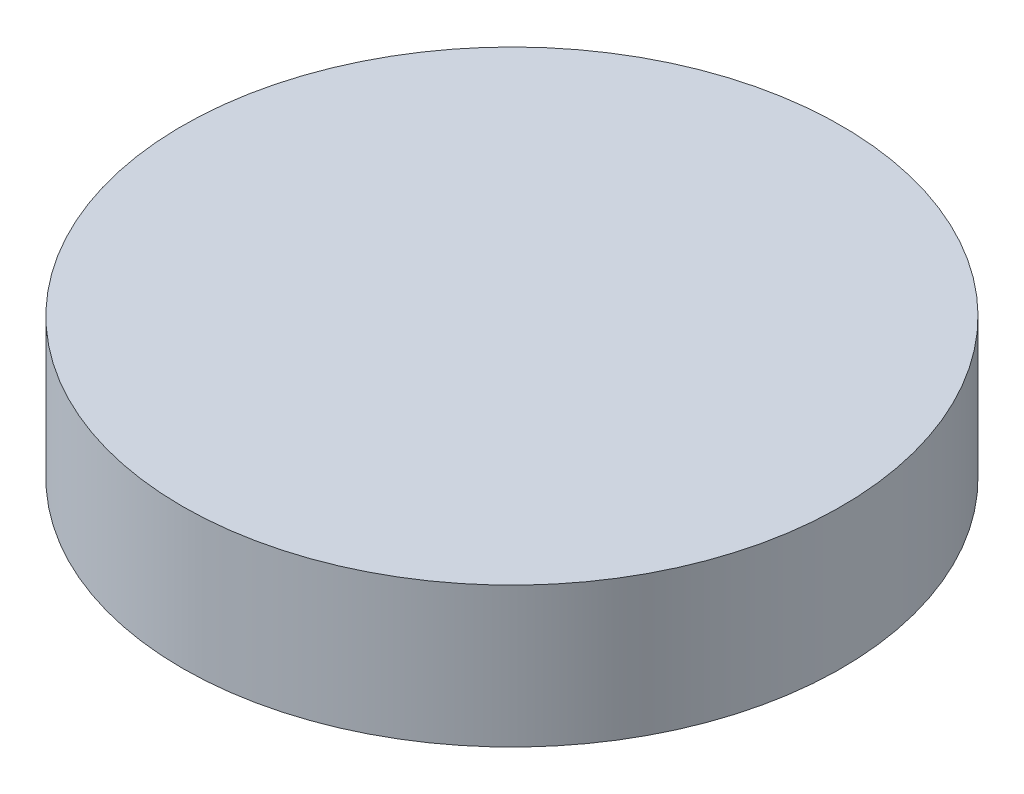
ISO-10303-21;
HEADER;
FILE_DESCRIPTION(('STEP AP214'),'2;1');
FILE_NAME('part.step','',(''),(''),'','','');
FILE_SCHEMA(('AUTOMOTIVE_DESIGN { 1 0 10303 214 1 1 1 1 }'));
ENDSEC;
DATA;
#1=APPLICATION_CONTEXT('core data for automotive mechanical design processes');
#2=APPLICATION_PROTOCOL_DEFINITION('international standard','automotive_design',2000,#1);
#3=PRODUCT_CONTEXT('',#1,'mechanical');
#4=PRODUCT('Part','Part','',(#3));
#5=PRODUCT_RELATED_PRODUCT_CATEGORY('part','',(#4));
#6=PRODUCT_DEFINITION_FORMATION('','',#4);
#7=PRODUCT_DEFINITION_CONTEXT('part definition',#1,'design');
#8=PRODUCT_DEFINITION('design','',#6,#7);
#9=PRODUCT_DEFINITION_SHAPE('','',#8);
#10=(LENGTH_UNIT() NAMED_UNIT(*) SI_UNIT(.MILLI.,.METRE.));
#11=(NAMED_UNIT(*) PLANE_ANGLE_UNIT() SI_UNIT($,.RADIAN.));
#12=(NAMED_UNIT(*) SI_UNIT($,.STERADIAN.) SOLID_ANGLE_UNIT());
#13=UNCERTAINTY_MEASURE_WITH_UNIT(LENGTH_MEASURE(1.E-05),#10,'distance_accuracy_value','');
#14=(GEOMETRIC_REPRESENTATION_CONTEXT(3) GLOBAL_UNCERTAINTY_ASSIGNED_CONTEXT((#13)) GLOBAL_UNIT_ASSIGNED_CONTEXT((#10,
#11,#12)) REPRESENTATION_CONTEXT('',''));
#15=CARTESIAN_POINT('',(0.,0.,0.));
#16=DIRECTION('',(0.,0.,1.));
#17=DIRECTION('',(1.,0.,0.));
#18=AXIS2_PLACEMENT_3D('',#15,#16,#17);
#19=CARTESIAN_POINT('',(0.,2.54,0.));
#20=DIRECTION('',(0.,-1.,0.));
#21=DIRECTION('',(0.,0.,-1.));
#22=AXIS2_PLACEMENT_3D('',#19,#20,#21);
#23=CYLINDRICAL_SURFACE('',#22,5.969);
#24=CARTESIAN_POINT('',(0.,2.54,0.));
#25=DIRECTION('',(0.,1.,0.));
#26=DIRECTION('',(0.,0.,1.));
#27=AXIS2_PLACEMENT_3D('',#24,#25,#26);
#28=CIRCLE('',#27,5.969);
#29=CARTESIAN_POINT('',(0.,2.54,5.969));
#30=VERTEX_POINT('',#29);
#31=EDGE_CURVE('E10',#30,#30,#28,.T.);
#32=ORIENTED_EDGE('',*,*,#31,.F.);
#33=EDGE_LOOP('',(#32));
#34=FACE_BOUND('',#33,.T.);
#35=CARTESIAN_POINT('',(0.,0.,0.));
#36=DIRECTION('',(0.,1.,0.));
#37=DIRECTION('',(0.,0.,1.));
#38=AXIS2_PLACEMENT_3D('',#35,#36,#37);
#39=CIRCLE('',#38,5.969);
#40=CARTESIAN_POINT('',(0.,0.,5.969));
#41=VERTEX_POINT('',#40);
#42=EDGE_CURVE('E44',#41,#41,#39,.T.);
#43=ORIENTED_EDGE('',*,*,#42,.T.);
#44=EDGE_LOOP('',(#43));
#45=FACE_BOUND('',#44,.T.);
#46=ADVANCED_FACE('F41',(#34,#45),#23,.T.);
#47=CARTESIAN_POINT('',(0.,2.54,0.));
#48=DIRECTION('',(0.,1.,0.));
#49=DIRECTION('',(0.,0.,1.));
#50=AXIS2_PLACEMENT_3D('',#47,#48,#49);
#51=PLANE('',#50);
#52=ORIENTED_EDGE('',*,*,#31,.T.);
#53=EDGE_LOOP('',(#52));
#54=FACE_BOUND('',#53,.T.);
#55=ADVANCED_FACE('F58',(#54),#51,.T.);
#56=CARTESIAN_POINT('',(0.,0.,0.));
#57=DIRECTION('',(0.,1.,0.));
#58=DIRECTION('',(0.,0.,1.));
#59=AXIS2_PLACEMENT_3D('',#56,#57,#58);
#60=PLANE('',#59);
#61=ORIENTED_EDGE('',*,*,#42,.F.);
#62=EDGE_LOOP('',(#61));
#63=FACE_BOUND('',#62,.T.);
#64=ADVANCED_FACE('F56',(#63),#60,.F.);
#65=CLOSED_SHELL('',(#46,#55,#64));
#66=MANIFOLD_SOLID_BREP('B2',#65);
#67=ADVANCED_BREP_SHAPE_REPRESENTATION('',(#18,#66),#14);
#68=SHAPE_DEFINITION_REPRESENTATION(#9,#67);
ENDSEC;
END-ISO-10303-21;
